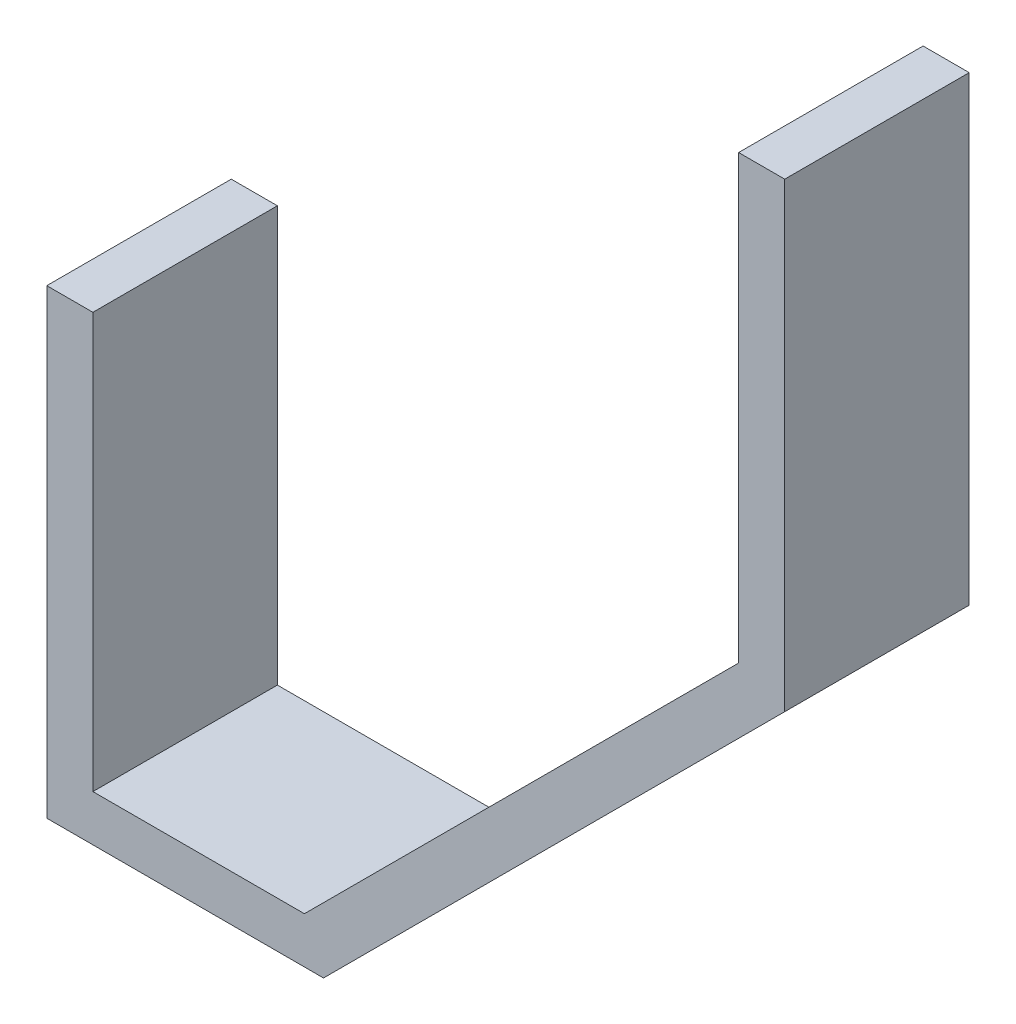
ISO-10303-21;
HEADER;
FILE_DESCRIPTION(('STEP AP214'),'2;1');
FILE_NAME('part.step','',(''),(''),'','','');
FILE_SCHEMA(('AUTOMOTIVE_DESIGN { 1 0 10303 214 1 1 1 1 }'));
ENDSEC;
DATA;
#1=APPLICATION_CONTEXT('core data for automotive mechanical design processes');
#2=APPLICATION_PROTOCOL_DEFINITION('international standard','automotive_design',2000,#1);
#3=PRODUCT_CONTEXT('',#1,'mechanical');
#4=PRODUCT('Part','Part','',(#3));
#5=PRODUCT_RELATED_PRODUCT_CATEGORY('part','',(#4));
#6=PRODUCT_DEFINITION_FORMATION('','',#4);
#7=PRODUCT_DEFINITION_CONTEXT('part definition',#1,'design');
#8=PRODUCT_DEFINITION('design','',#6,#7);
#9=PRODUCT_DEFINITION_SHAPE('','',#8);
#10=(LENGTH_UNIT() NAMED_UNIT(*) SI_UNIT(.MILLI.,.METRE.));
#11=(NAMED_UNIT(*) PLANE_ANGLE_UNIT() SI_UNIT($,.RADIAN.));
#12=(NAMED_UNIT(*) SI_UNIT($,.STERADIAN.) SOLID_ANGLE_UNIT());
#13=UNCERTAINTY_MEASURE_WITH_UNIT(LENGTH_MEASURE(1.E-05),#10,'distance_accuracy_value','');
#14=(GEOMETRIC_REPRESENTATION_CONTEXT(3) GLOBAL_UNCERTAINTY_ASSIGNED_CONTEXT((#13)) GLOBAL_UNIT_ASSIGNED_CONTEXT((#10,
#11,#12)) REPRESENTATION_CONTEXT('',''));
#15=CARTESIAN_POINT('',(0.,0.,0.));
#16=DIRECTION('',(0.,0.,1.));
#17=DIRECTION('',(1.,0.,0.));
#18=AXIS2_PLACEMENT_3D('',#15,#16,#17);
#19=CARTESIAN_POINT('',(0.,0.,20.));
#20=DIRECTION('',(0.,1.,0.));
#21=DIRECTION('',(0.,0.,1.));
#22=AXIS2_PLACEMENT_3D('',#19,#20,#21);
#23=PLANE('',#22);
#24=DIRECTION('',(1.,0.,0.));
#25=VECTOR('',#24,1.);
#26=CARTESIAN_POINT('',(0.,0.,0.));
#27=LINE('',#26,#25);
#28=CARTESIAN_POINT('',(0.,0.,0.));
#29=VERTEX_POINT('',#28);
#30=CARTESIAN_POINT('',(30.,0.,0.));
#31=VERTEX_POINT('',#30);
#32=EDGE_CURVE('E144',#29,#31,#27,.T.);
#33=ORIENTED_EDGE('',*,*,#32,.T.);
#34=DIRECTION('',(0.,0.,-1.));
#35=VECTOR('',#34,1.);
#36=CARTESIAN_POINT('',(30.,0.,20.));
#37=LINE('',#36,#35);
#38=CARTESIAN_POINT('',(30.,0.,20.));
#39=VERTEX_POINT('',#38);
#40=EDGE_CURVE('E11',#39,#31,#37,.T.);
#41=ORIENTED_EDGE('',*,*,#40,.F.);
#42=DIRECTION('',(1.,0.,0.));
#43=VECTOR('',#42,1.);
#44=CARTESIAN_POINT('',(0.,0.,20.));
#45=LINE('',#44,#43);
#46=CARTESIAN_POINT('',(0.,0.,20.));
#47=VERTEX_POINT('',#46);
#48=EDGE_CURVE('E162',#47,#39,#45,.T.);
#49=ORIENTED_EDGE('',*,*,#48,.F.);
#50=DIRECTION('',(0.,0.,-1.));
#51=VECTOR('',#50,1.);
#52=CARTESIAN_POINT('',(0.,0.,20.));
#53=LINE('',#52,#51);
#54=EDGE_CURVE('E140',#47,#29,#53,.T.);
#55=ORIENTED_EDGE('',*,*,#54,.T.);
#56=EDGE_LOOP('',(#33,#41,#49,#55));
#57=FACE_BOUND('',#56,.T.);
#58=ADVANCED_FACE('F36',(#57),#23,.F.);
#59=CARTESIAN_POINT('',(30.,0.,20.));
#60=DIRECTION('',(-0.707106781186549,0.707106781186546,0.));
#61=DIRECTION('',(-0.707106781186546,-0.707106781186549,0.));
#62=AXIS2_PLACEMENT_3D('',#59,#60,#61);
#63=PLANE('',#62);
#64=DIRECTION('',(0.707106781186546,0.707106781186549,0.));
#65=VECTOR('',#64,1.);
#66=CARTESIAN_POINT('',(30.,0.,0.));
#67=LINE('',#66,#65);
#68=CARTESIAN_POINT('',(80.,50.0000000000002,0.));
#69=VERTEX_POINT('',#68);
#70=EDGE_CURVE('E147',#31,#69,#67,.T.);
#71=ORIENTED_EDGE('',*,*,#70,.T.);
#72=DIRECTION('',(0.,0.,-1.));
#73=VECTOR('',#72,1.);
#74=CARTESIAN_POINT('',(80.,50.0000000000002,20.));
#75=LINE('',#74,#73);
#76=CARTESIAN_POINT('',(80.,50.0000000000002,20.));
#77=VERTEX_POINT('',#76);
#78=EDGE_CURVE('E44',#77,#69,#75,.T.);
#79=ORIENTED_EDGE('',*,*,#78,.F.);
#80=DIRECTION('',(0.707106781186546,0.707106781186549,0.));
#81=VECTOR('',#80,1.);
#82=CARTESIAN_POINT('',(30.,0.,20.));
#83=LINE('',#82,#81);
#84=EDGE_CURVE('E101',#39,#77,#83,.T.);
#85=ORIENTED_EDGE('',*,*,#84,.F.);
#86=ORIENTED_EDGE('',*,*,#40,.T.);
#87=EDGE_LOOP('',(#71,#79,#85,#86));
#88=FACE_BOUND('',#87,.T.);
#89=ADVANCED_FACE('F211',(#88),#63,.F.);
#90=CARTESIAN_POINT('',(80.,50.0000000000002,20.));
#91=DIRECTION('',(-1.,0.,0.));
#92=DIRECTION('',(0.,0.,1.));
#93=AXIS2_PLACEMENT_3D('',#90,#91,#92);
#94=PLANE('',#93);
#95=DIRECTION('',(0.,1.,0.));
#96=VECTOR('',#95,1.);
#97=CARTESIAN_POINT('',(80.,50.0000000000002,0.));
#98=LINE('',#97,#96);
#99=CARTESIAN_POINT('',(80.,100.,0.));
#100=VERTEX_POINT('',#99);
#101=EDGE_CURVE('E149',#69,#100,#98,.T.);
#102=ORIENTED_EDGE('',*,*,#101,.T.);
#103=DIRECTION('',(0.,0.,-1.));
#104=VECTOR('',#103,1.);
#105=CARTESIAN_POINT('',(80.,100.,20.));
#106=LINE('',#105,#104);
#107=CARTESIAN_POINT('',(80.,100.,20.));
#108=VERTEX_POINT('',#107);
#109=EDGE_CURVE('E175',#108,#100,#106,.T.);
#110=ORIENTED_EDGE('',*,*,#109,.F.);
#111=DIRECTION('',(0.,1.,0.));
#112=VECTOR('',#111,1.);
#113=CARTESIAN_POINT('',(80.,50.0000000000002,20.));
#114=LINE('',#113,#112);
#115=EDGE_CURVE('E183',#77,#108,#114,.T.);
#116=ORIENTED_EDGE('',*,*,#115,.F.);
#117=ORIENTED_EDGE('',*,*,#78,.T.);
#118=EDGE_LOOP('',(#102,#110,#116,#117));
#119=FACE_BOUND('',#118,.T.);
#120=ADVANCED_FACE('F181',(#119),#94,.F.);
#121=CARTESIAN_POINT('',(80.,100.,20.));
#122=DIRECTION('',(0.,-1.,0.));
#123=DIRECTION('',(1.,0.,0.));
#124=AXIS2_PLACEMENT_3D('',#121,#122,#123);
#125=PLANE('',#124);
#126=DIRECTION('',(-1.,0.,0.));
#127=VECTOR('',#126,1.);
#128=CARTESIAN_POINT('',(80.,100.,0.));
#129=LINE('',#128,#127);
#130=CARTESIAN_POINT('',(75.,100.,0.));
#131=VERTEX_POINT('',#130);
#132=EDGE_CURVE('E151',#100,#131,#129,.T.);
#133=ORIENTED_EDGE('',*,*,#132,.T.);
#134=DIRECTION('',(0.,0.,-1.));
#135=VECTOR('',#134,1.);
#136=CARTESIAN_POINT('',(75.,100.,20.));
#137=LINE('',#136,#135);
#138=CARTESIAN_POINT('',(75.,100.,20.));
#139=VERTEX_POINT('',#138);
#140=EDGE_CURVE('E172',#139,#131,#137,.T.);
#141=ORIENTED_EDGE('',*,*,#140,.F.);
#142=DIRECTION('',(-1.,0.,0.));
#143=VECTOR('',#142,1.);
#144=CARTESIAN_POINT('',(80.,100.,20.));
#145=LINE('',#144,#143);
#146=EDGE_CURVE('E201',#108,#139,#145,.T.);
#147=ORIENTED_EDGE('',*,*,#146,.F.);
#148=ORIENTED_EDGE('',*,*,#109,.T.);
#149=EDGE_LOOP('',(#133,#141,#147,#148));
#150=FACE_BOUND('',#149,.T.);
#151=ADVANCED_FACE('F192',(#150),#125,.F.);
#152=CARTESIAN_POINT('',(75.,100.,20.));
#153=DIRECTION('',(1.,0.,0.));
#154=DIRECTION('',(0.,0.,-1.));
#155=AXIS2_PLACEMENT_3D('',#152,#153,#154);
#156=PLANE('',#155);
#157=DIRECTION('',(0.,-1.,0.));
#158=VECTOR('',#157,1.);
#159=CARTESIAN_POINT('',(75.,100.,0.));
#160=LINE('',#159,#158);
#161=CARTESIAN_POINT('',(75.,52.0710678118657,0.));
#162=VERTEX_POINT('',#161);
#163=EDGE_CURVE('E153',#131,#162,#160,.T.);
#164=ORIENTED_EDGE('',*,*,#163,.T.);
#165=DIRECTION('',(0.,0.,-1.));
#166=VECTOR('',#165,1.);
#167=CARTESIAN_POINT('',(75.,52.0710678118657,20.));
#168=LINE('',#167,#166);
#169=CARTESIAN_POINT('',(75.,52.0710678118657,20.));
#170=VERTEX_POINT('',#169);
#171=EDGE_CURVE('E169',#170,#162,#168,.T.);
#172=ORIENTED_EDGE('',*,*,#171,.F.);
#173=DIRECTION('',(0.,-1.,0.));
#174=VECTOR('',#173,1.);
#175=CARTESIAN_POINT('',(75.,100.,20.));
#176=LINE('',#175,#174);
#177=EDGE_CURVE('E198',#139,#170,#176,.T.);
#178=ORIENTED_EDGE('',*,*,#177,.F.);
#179=ORIENTED_EDGE('',*,*,#140,.T.);
#180=EDGE_LOOP('',(#164,#172,#178,#179));
#181=FACE_BOUND('',#180,.T.);
#182=ADVANCED_FACE('F196',(#181),#156,.F.);
#183=CARTESIAN_POINT('',(75.,52.0710678118657,20.));
#184=DIRECTION('',(0.707106781186549,-0.707106781186546,0.));
#185=DIRECTION('',(0.707106781186546,0.707106781186549,0.));
#186=AXIS2_PLACEMENT_3D('',#183,#184,#185);
#187=PLANE('',#186);
#188=DIRECTION('',(-0.707106781186546,-0.707106781186549,0.));
#189=VECTOR('',#188,1.);
#190=CARTESIAN_POINT('',(75.,52.0710678118657,0.));
#191=LINE('',#190,#189);
#192=CARTESIAN_POINT('',(27.9289321881345,5.,0.));
#193=VERTEX_POINT('',#192);
#194=EDGE_CURVE('E155',#162,#193,#191,.T.);
#195=ORIENTED_EDGE('',*,*,#194,.T.);
#196=DIRECTION('',(0.,0.,-1.));
#197=VECTOR('',#196,1.);
#198=CARTESIAN_POINT('',(27.9289321881345,5.,20.));
#199=LINE('',#198,#197);
#200=CARTESIAN_POINT('',(27.9289321881345,5.,20.));
#201=VERTEX_POINT('',#200);
#202=EDGE_CURVE('E166',#201,#193,#199,.T.);
#203=ORIENTED_EDGE('',*,*,#202,.F.);
#204=DIRECTION('',(-0.707106781186546,-0.707106781186549,0.));
#205=VECTOR('',#204,1.);
#206=CARTESIAN_POINT('',(75.,52.0710678118657,20.));
#207=LINE('',#206,#205);
#208=EDGE_CURVE('E200',#170,#201,#207,.T.);
#209=ORIENTED_EDGE('',*,*,#208,.F.);
#210=ORIENTED_EDGE('',*,*,#171,.T.);
#211=EDGE_LOOP('',(#195,#203,#209,#210));
#212=FACE_BOUND('',#211,.T.);
#213=ADVANCED_FACE('F223',(#212),#187,.F.);
#214=CARTESIAN_POINT('',(27.9289321881345,5.,20.));
#215=DIRECTION('',(0.,-1.,0.));
#216=DIRECTION('',(1.,0.,0.));
#217=AXIS2_PLACEMENT_3D('',#214,#215,#216);
#218=PLANE('',#217);
#219=DIRECTION('',(-1.,0.,0.));
#220=VECTOR('',#219,1.);
#221=CARTESIAN_POINT('',(27.9289321881345,5.,0.));
#222=LINE('',#221,#220);
#223=CARTESIAN_POINT('',(5.,5.,0.));
#224=VERTEX_POINT('',#223);
#225=EDGE_CURVE('E157',#193,#224,#222,.T.);
#226=ORIENTED_EDGE('',*,*,#225,.T.);
#227=DIRECTION('',(0.,0.,-1.));
#228=VECTOR('',#227,1.);
#229=CARTESIAN_POINT('',(5.,5.,20.));
#230=LINE('',#229,#228);
#231=CARTESIAN_POINT('',(5.,5.,20.));
#232=VERTEX_POINT('',#231);
#233=EDGE_CURVE('E135',#232,#224,#230,.T.);
#234=ORIENTED_EDGE('',*,*,#233,.F.);
#235=DIRECTION('',(-1.,0.,0.));
#236=VECTOR('',#235,1.);
#237=CARTESIAN_POINT('',(27.9289321881345,5.,20.));
#238=LINE('',#237,#236);
#239=EDGE_CURVE('E126',#201,#232,#238,.T.);
#240=ORIENTED_EDGE('',*,*,#239,.F.);
#241=ORIENTED_EDGE('',*,*,#202,.T.);
#242=EDGE_LOOP('',(#226,#234,#240,#241));
#243=FACE_BOUND('',#242,.T.);
#244=ADVANCED_FACE('F226',(#243),#218,.F.);
#245=CARTESIAN_POINT('',(5.,5.,20.));
#246=DIRECTION('',(-1.,0.,0.));
#247=DIRECTION('',(0.,0.,1.));
#248=AXIS2_PLACEMENT_3D('',#245,#246,#247);
#249=PLANE('',#248);
#250=DIRECTION('',(0.,1.,0.));
#251=VECTOR('',#250,1.);
#252=CARTESIAN_POINT('',(5.,5.,0.));
#253=LINE('',#252,#251);
#254=CARTESIAN_POINT('',(5.,50.,0.));
#255=VERTEX_POINT('',#254);
#256=EDGE_CURVE('E134',#224,#255,#253,.T.);
#257=ORIENTED_EDGE('',*,*,#256,.T.);
#258=DIRECTION('',(0.,0.,-1.));
#259=VECTOR('',#258,1.);
#260=CARTESIAN_POINT('',(5.,50.,20.));
#261=LINE('',#260,#259);
#262=CARTESIAN_POINT('',(5.,50.,20.));
#263=VERTEX_POINT('',#262);
#264=EDGE_CURVE('E131',#263,#255,#261,.T.);
#265=ORIENTED_EDGE('',*,*,#264,.F.);
#266=DIRECTION('',(0.,1.,0.));
#267=VECTOR('',#266,1.);
#268=CARTESIAN_POINT('',(5.,5.,20.));
#269=LINE('',#268,#267);
#270=EDGE_CURVE('E120',#232,#263,#269,.T.);
#271=ORIENTED_EDGE('',*,*,#270,.F.);
#272=ORIENTED_EDGE('',*,*,#233,.T.);
#273=EDGE_LOOP('',(#257,#265,#271,#272));
#274=FACE_BOUND('',#273,.T.);
#275=ADVANCED_FACE('F132',(#274),#249,.F.);
#276=CARTESIAN_POINT('',(5.,50.,20.));
#277=DIRECTION('',(0.,-1.,0.));
#278=DIRECTION('',(0.,0.,-1.));
#279=AXIS2_PLACEMENT_3D('',#276,#277,#278);
#280=PLANE('',#279);
#281=DIRECTION('',(-1.,0.,0.));
#282=VECTOR('',#281,1.);
#283=CARTESIAN_POINT('',(5.,50.,0.));
#284=LINE('',#283,#282);
#285=CARTESIAN_POINT('',(0.,50.,0.));
#286=VERTEX_POINT('',#285);
#287=EDGE_CURVE('E87',#255,#286,#284,.T.);
#288=ORIENTED_EDGE('',*,*,#287,.T.);
#289=DIRECTION('',(0.,0.,-1.));
#290=VECTOR('',#289,1.);
#291=CARTESIAN_POINT('',(0.,50.,20.));
#292=LINE('',#291,#290);
#293=CARTESIAN_POINT('',(0.,50.,20.));
#294=VERTEX_POINT('',#293);
#295=EDGE_CURVE('E136',#294,#286,#292,.T.);
#296=ORIENTED_EDGE('',*,*,#295,.F.);
#297=DIRECTION('',(-1.,0.,0.));
#298=VECTOR('',#297,1.);
#299=CARTESIAN_POINT('',(5.,50.,20.));
#300=LINE('',#299,#298);
#301=EDGE_CURVE('E124',#263,#294,#300,.T.);
#302=ORIENTED_EDGE('',*,*,#301,.F.);
#303=ORIENTED_EDGE('',*,*,#264,.T.);
#304=EDGE_LOOP('',(#288,#296,#302,#303));
#305=FACE_BOUND('',#304,.T.);
#306=ADVANCED_FACE('F138',(#305),#280,.F.);
#307=CARTESIAN_POINT('',(0.,50.,20.));
#308=DIRECTION('',(1.,0.,0.));
#309=DIRECTION('',(0.,1.,0.));
#310=AXIS2_PLACEMENT_3D('',#307,#308,#309);
#311=PLANE('',#310);
#312=DIRECTION('',(0.,-1.,0.));
#313=VECTOR('',#312,1.);
#314=CARTESIAN_POINT('',(0.,50.,0.));
#315=LINE('',#314,#313);
#316=EDGE_CURVE('E93',#286,#29,#315,.T.);
#317=ORIENTED_EDGE('',*,*,#316,.T.);
#318=ORIENTED_EDGE('',*,*,#54,.F.);
#319=DIRECTION('',(0.,-1.,0.));
#320=VECTOR('',#319,1.);
#321=CARTESIAN_POINT('',(0.,50.,20.));
#322=LINE('',#321,#320);
#323=EDGE_CURVE('E52',#294,#47,#322,.T.);
#324=ORIENTED_EDGE('',*,*,#323,.F.);
#325=ORIENTED_EDGE('',*,*,#295,.T.);
#326=EDGE_LOOP('',(#317,#318,#324,#325));
#327=FACE_BOUND('',#326,.T.);
#328=ADVANCED_FACE('F235',(#327),#311,.F.);
#329=CARTESIAN_POINT('',(0.,0.,20.));
#330=DIRECTION('',(0.,0.,1.));
#331=DIRECTION('',(1.,0.,0.));
#332=AXIS2_PLACEMENT_3D('',#329,#330,#331);
#333=PLANE('',#332);
#334=ORIENTED_EDGE('',*,*,#48,.T.);
#335=ORIENTED_EDGE('',*,*,#84,.T.);
#336=ORIENTED_EDGE('',*,*,#115,.T.);
#337=ORIENTED_EDGE('',*,*,#146,.T.);
#338=ORIENTED_EDGE('',*,*,#177,.T.);
#339=ORIENTED_EDGE('',*,*,#208,.T.);
#340=ORIENTED_EDGE('',*,*,#239,.T.);
#341=ORIENTED_EDGE('',*,*,#270,.T.);
#342=ORIENTED_EDGE('',*,*,#301,.T.);
#343=ORIENTED_EDGE('',*,*,#323,.T.);
#344=EDGE_LOOP('',(#334,#335,#336,#337,#338,#339,#340,#341,#342,#343));
#345=FACE_BOUND('',#344,.T.);
#346=ADVANCED_FACE('F122',(#345),#333,.T.);
#347=CARTESIAN_POINT('',(0.,0.,0.));
#348=DIRECTION('',(0.,0.,1.));
#349=DIRECTION('',(1.,0.,0.));
#350=AXIS2_PLACEMENT_3D('',#347,#348,#349);
#351=PLANE('',#350);
#352=ORIENTED_EDGE('',*,*,#32,.F.);
#353=ORIENTED_EDGE('',*,*,#316,.F.);
#354=ORIENTED_EDGE('',*,*,#287,.F.);
#355=ORIENTED_EDGE('',*,*,#256,.F.);
#356=ORIENTED_EDGE('',*,*,#225,.F.);
#357=ORIENTED_EDGE('',*,*,#194,.F.);
#358=ORIENTED_EDGE('',*,*,#163,.F.);
#359=ORIENTED_EDGE('',*,*,#132,.F.);
#360=ORIENTED_EDGE('',*,*,#101,.F.);
#361=ORIENTED_EDGE('',*,*,#70,.F.);
#362=EDGE_LOOP('',(#352,#353,#354,#355,#356,#357,#358,#359,#360,#361));
#363=FACE_BOUND('',#362,.T.);
#364=ADVANCED_FACE('F187',(#363),#351,.F.);
#365=CLOSED_SHELL('',(#58,#89,#120,#151,#182,#213,#244,#275,#306,#328,#346,#364));
#366=MANIFOLD_SOLID_BREP('B2',#365);
#367=ADVANCED_BREP_SHAPE_REPRESENTATION('',(#18,#366),#14);
#368=SHAPE_DEFINITION_REPRESENTATION(#9,#367);
ENDSEC;
END-ISO-10303-21;
